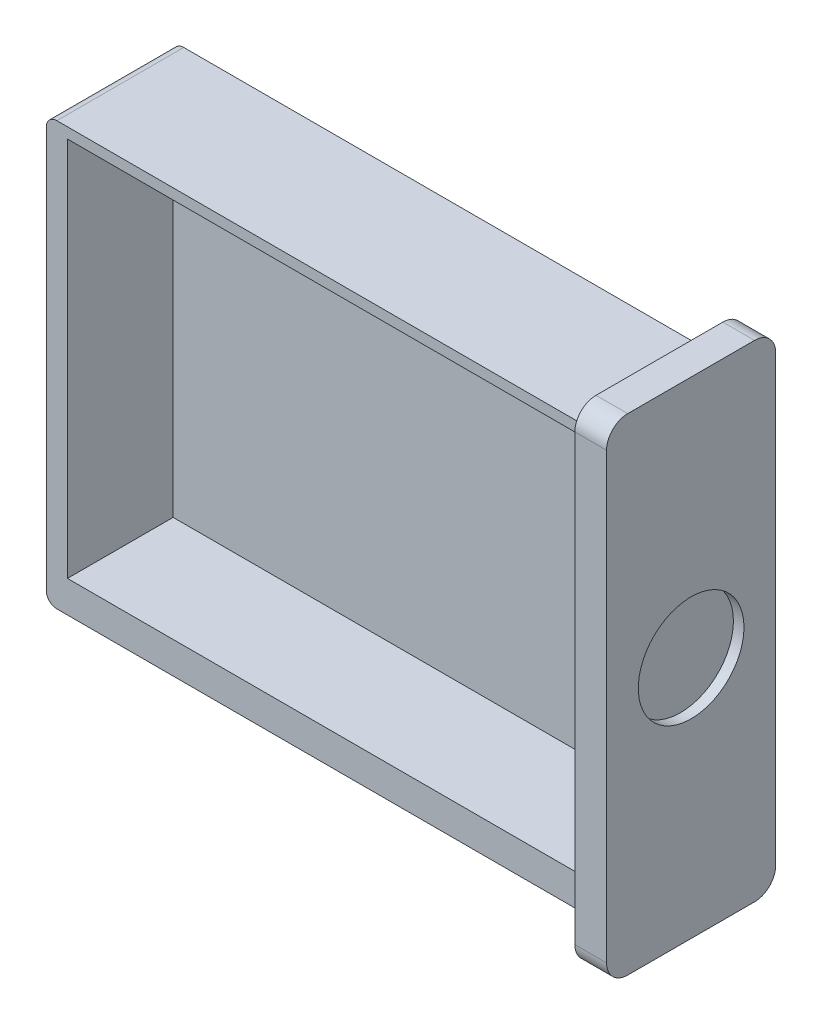
ISO-10303-21;
HEADER;
FILE_DESCRIPTION(('STEP AP214'),'2;1');
FILE_NAME('part.step','',(''),(''),'','','');
FILE_SCHEMA(('AUTOMOTIVE_DESIGN { 1 0 10303 214 1 1 1 1 }'));
ENDSEC;
DATA;
#1=APPLICATION_CONTEXT('core data for automotive mechanical design processes');
#2=APPLICATION_PROTOCOL_DEFINITION('international standard','automotive_design',2000,#1);
#3=PRODUCT_CONTEXT('',#1,'mechanical');
#4=PRODUCT('Part','Part','',(#3));
#5=PRODUCT_RELATED_PRODUCT_CATEGORY('part','',(#4));
#6=PRODUCT_DEFINITION_FORMATION('','',#4);
#7=PRODUCT_DEFINITION_CONTEXT('part definition',#1,'design');
#8=PRODUCT_DEFINITION('design','',#6,#7);
#9=PRODUCT_DEFINITION_SHAPE('','',#8);
#10=(LENGTH_UNIT() NAMED_UNIT(*) SI_UNIT(.MILLI.,.METRE.));
#11=(NAMED_UNIT(*) PLANE_ANGLE_UNIT() SI_UNIT($,.RADIAN.));
#12=(NAMED_UNIT(*) SI_UNIT($,.STERADIAN.) SOLID_ANGLE_UNIT());
#13=UNCERTAINTY_MEASURE_WITH_UNIT(LENGTH_MEASURE(1.E-05),#10,'distance_accuracy_value','');
#14=(GEOMETRIC_REPRESENTATION_CONTEXT(3) GLOBAL_UNCERTAINTY_ASSIGNED_CONTEXT((#13)) GLOBAL_UNIT_ASSIGNED_CONTEXT((#10,
#11,#12)) REPRESENTATION_CONTEXT('',''));
#15=CARTESIAN_POINT('',(0.,0.,0.));
#16=DIRECTION('',(0.,0.,1.));
#17=DIRECTION('',(1.,0.,0.));
#18=AXIS2_PLACEMENT_3D('',#15,#16,#17);
#19=CARTESIAN_POINT('',(-26.,20.,6.));
#20=DIRECTION('',(1.,0.,0.));
#21=DIRECTION('',(0.,0.,-1.));
#22=AXIS2_PLACEMENT_3D('',#19,#20,#21);
#23=PLANE('',#22);
#24=DIRECTION('',(0.,-1.,0.));
#25=VECTOR('',#24,1.);
#26=CARTESIAN_POINT('',(-26.,11.,-1.5));
#27=LINE('',#26,#25);
#28=CARTESIAN_POINT('',(-26.,11.,-1.5));
#29=VERTEX_POINT('',#28);
#30=CARTESIAN_POINT('',(-26.,5.,-1.5));
#31=VERTEX_POINT('',#30);
#32=EDGE_CURVE('E240',#29,#31,#27,.T.);
#33=ORIENTED_EDGE('',*,*,#32,.F.);
#34=DIRECTION('',(0.,0.,-1.));
#35=VECTOR('',#34,1.);
#36=CARTESIAN_POINT('',(-26.,11.,-1.5));
#37=LINE('',#36,#35);
#38=CARTESIAN_POINT('',(-26.,11.,1.5));
#39=VERTEX_POINT('',#38);
#40=EDGE_CURVE('E253',#39,#29,#37,.T.);
#41=ORIENTED_EDGE('',*,*,#40,.F.);
#42=DIRECTION('',(0.,1.,0.));
#43=VECTOR('',#42,1.);
#44=CARTESIAN_POINT('',(-26.,11.,1.5));
#45=LINE('',#44,#43);
#46=CARTESIAN_POINT('',(-26.,5.,1.5));
#47=VERTEX_POINT('',#46);
#48=EDGE_CURVE('E262',#47,#39,#45,.T.);
#49=ORIENTED_EDGE('',*,*,#48,.F.);
#50=DIRECTION('',(0.,0.,1.));
#51=VECTOR('',#50,1.);
#52=CARTESIAN_POINT('',(-26.,5.,-1.5));
#53=LINE('',#52,#51);
#54=EDGE_CURVE('E243',#31,#47,#53,.T.);
#55=ORIENTED_EDGE('',*,*,#54,.F.);
#56=EDGE_LOOP('',(#33,#41,#49,#55));
#57=FACE_BOUND('',#56,.T.);
#58=DIRECTION('',(0.,-1.,0.));
#59=VECTOR('',#58,1.);
#60=CARTESIAN_POINT('',(-26.,20.,-6.));
#61=LINE('',#60,#59);
#62=CARTESIAN_POINT('',(-26.,19.,-6.));
#63=VERTEX_POINT('',#62);
#64=CARTESIAN_POINT('',(-26.,-19.,-6.));
#65=VERTEX_POINT('',#64);
#66=EDGE_CURVE('E334',#63,#65,#61,.T.);
#67=ORIENTED_EDGE('',*,*,#66,.T.);
#68=DIRECTION('',(0.,0.,-1.));
#69=VECTOR('',#68,1.);
#70=CARTESIAN_POINT('',(-26.,-19.,6.));
#71=LINE('',#70,#69);
#72=CARTESIAN_POINT('',(-26.,-19.,6.));
#73=VERTEX_POINT('',#72);
#74=EDGE_CURVE('E380',#65,#73,#71,.F.);
#75=ORIENTED_EDGE('',*,*,#74,.T.);
#76=DIRECTION('',(0.,-1.,0.));
#77=VECTOR('',#76,1.);
#78=CARTESIAN_POINT('',(-26.,20.,6.));
#79=LINE('',#78,#77);
#80=CARTESIAN_POINT('',(-26.,19.,6.));
#81=VERTEX_POINT('',#80);
#82=EDGE_CURVE('E341',#81,#73,#79,.T.);
#83=ORIENTED_EDGE('',*,*,#82,.F.);
#84=DIRECTION('',(0.,0.,-1.));
#85=VECTOR('',#84,1.);
#86=CARTESIAN_POINT('',(-26.,19.,6.));
#87=LINE('',#86,#85);
#88=EDGE_CURVE('E377',#81,#63,#87,.T.);
#89=ORIENTED_EDGE('',*,*,#88,.T.);
#90=EDGE_LOOP('',(#67,#75,#83,#89));
#91=FACE_BOUND('',#90,.T.);
#92=DIRECTION('',(0.,0.,1.));
#93=VECTOR('',#92,1.);
#94=CARTESIAN_POINT('',(-26.,-11.,-1.5));
#95=LINE('',#94,#93);
#96=CARTESIAN_POINT('',(-26.,-11.,-1.5));
#97=VERTEX_POINT('',#96);
#98=CARTESIAN_POINT('',(-26.,-11.,1.5));
#99=VERTEX_POINT('',#98);
#100=EDGE_CURVE('E239',#97,#99,#95,.T.);
#101=ORIENTED_EDGE('',*,*,#100,.F.);
#102=DIRECTION('',(0.,-1.,0.));
#103=VECTOR('',#102,1.);
#104=CARTESIAN_POINT('',(-26.,-11.,-1.5));
#105=LINE('',#104,#103);
#106=CARTESIAN_POINT('',(-26.,-5.,-1.5));
#107=VERTEX_POINT('',#106);
#108=EDGE_CURVE('E236',#107,#97,#105,.T.);
#109=ORIENTED_EDGE('',*,*,#108,.F.);
#110=DIRECTION('',(0.,0.,-1.));
#111=VECTOR('',#110,1.);
#112=CARTESIAN_POINT('',(-26.,-5.,-1.5));
#113=LINE('',#112,#111);
#114=CARTESIAN_POINT('',(-26.,-5.,1.5));
#115=VERTEX_POINT('',#114);
#116=EDGE_CURVE('E54',#115,#107,#113,.T.);
#117=ORIENTED_EDGE('',*,*,#116,.F.);
#118=DIRECTION('',(0.,1.,0.));
#119=VECTOR('',#118,1.);
#120=CARTESIAN_POINT('',(-26.,-11.,1.5));
#121=LINE('',#120,#119);
#122=EDGE_CURVE('E49',#99,#115,#121,.T.);
#123=ORIENTED_EDGE('',*,*,#122,.F.);
#124=EDGE_LOOP('',(#101,#109,#117,#123));
#125=FACE_BOUND('',#124,.T.);
#126=ADVANCED_FACE('F34',(#57,#91,#125),#23,.F.);
#127=CARTESIAN_POINT('',(-26.,-20.,6.));
#128=DIRECTION('',(0.,1.,0.));
#129=DIRECTION('',(0.,0.,1.));
#130=AXIS2_PLACEMENT_3D('',#127,#128,#129);
#131=PLANE('',#130);
#132=DIRECTION('',(1.,0.,0.));
#133=VECTOR('',#132,1.);
#134=CARTESIAN_POINT('',(-26.,-20.,6.));
#135=LINE('',#134,#133);
#136=CARTESIAN_POINT('',(-25.,-20.,6.));
#137=VERTEX_POINT('',#136);
#138=CARTESIAN_POINT('',(25.,-20.,6.));
#139=VERTEX_POINT('',#138);
#140=EDGE_CURVE('E344',#137,#139,#135,.T.);
#141=ORIENTED_EDGE('',*,*,#140,.F.);
#142=DIRECTION('',(0.,0.,-1.));
#143=VECTOR('',#142,1.);
#144=CARTESIAN_POINT('',(-25.,-20.,6.));
#145=LINE('',#144,#143);
#146=CARTESIAN_POINT('',(-25.,-20.,-6.));
#147=VERTEX_POINT('',#146);
#148=EDGE_CURVE('E366',#137,#147,#145,.T.);
#149=ORIENTED_EDGE('',*,*,#148,.T.);
#150=DIRECTION('',(1.,0.,0.));
#151=VECTOR('',#150,1.);
#152=CARTESIAN_POINT('',(-26.,-20.,-6.));
#153=LINE('',#152,#151);
#154=CARTESIAN_POINT('',(25.,-20.,-6.));
#155=VERTEX_POINT('',#154);
#156=EDGE_CURVE('E357',#147,#155,#153,.T.);
#157=ORIENTED_EDGE('',*,*,#156,.T.);
#158=DIRECTION('',(0.,0.,-1.));
#159=VECTOR('',#158,1.);
#160=CARTESIAN_POINT('',(25.,-20.,6.));
#161=LINE('',#160,#159);
#162=EDGE_CURVE('E354',#155,#139,#161,.F.);
#163=ORIENTED_EDGE('',*,*,#162,.T.);
#164=EDGE_LOOP('',(#141,#149,#157,#163));
#165=FACE_BOUND('',#164,.T.);
#166=ADVANCED_FACE('F478',(#165),#131,.F.);
#167=CARTESIAN_POINT('',(-26.,20.,6.));
#168=DIRECTION('',(0.,-1.,0.));
#169=DIRECTION('',(0.,0.,-1.));
#170=AXIS2_PLACEMENT_3D('',#167,#168,#169);
#171=PLANE('',#170);
#172=DIRECTION('',(-1.,0.,0.));
#173=VECTOR('',#172,1.);
#174=CARTESIAN_POINT('',(-26.,20.,-6.));
#175=LINE('',#174,#173);
#176=CARTESIAN_POINT('',(25.,20.,-6.));
#177=VERTEX_POINT('',#176);
#178=CARTESIAN_POINT('',(-25.,20.,-6.));
#179=VERTEX_POINT('',#178);
#180=EDGE_CURVE('E345',#177,#179,#175,.T.);
#181=ORIENTED_EDGE('',*,*,#180,.T.);
#182=DIRECTION('',(0.,0.,-1.));
#183=VECTOR('',#182,1.);
#184=CARTESIAN_POINT('',(-25.,20.,6.));
#185=LINE('',#184,#183);
#186=CARTESIAN_POINT('',(-25.,20.,6.));
#187=VERTEX_POINT('',#186);
#188=EDGE_CURVE('E399',#179,#187,#185,.F.);
#189=ORIENTED_EDGE('',*,*,#188,.T.);
#190=DIRECTION('',(-1.,0.,0.));
#191=VECTOR('',#190,1.);
#192=CARTESIAN_POINT('',(-26.,20.,6.));
#193=LINE('',#192,#191);
#194=CARTESIAN_POINT('',(25.,20.,6.));
#195=VERTEX_POINT('',#194);
#196=EDGE_CURVE('E351',#195,#187,#193,.T.);
#197=ORIENTED_EDGE('',*,*,#196,.F.);
#198=DIRECTION('',(0.,0.,-1.));
#199=VECTOR('',#198,1.);
#200=CARTESIAN_POINT('',(25.,20.,6.));
#201=LINE('',#200,#199);
#202=EDGE_CURVE('E396',#195,#177,#201,.T.);
#203=ORIENTED_EDGE('',*,*,#202,.T.);
#204=EDGE_LOOP('',(#181,#189,#197,#203));
#205=FACE_BOUND('',#204,.T.);
#206=ADVANCED_FACE('F484',(#205),#171,.F.);
#207=CARTESIAN_POINT('',(0.,0.,6.));
#208=DIRECTION('',(0.,0.,1.));
#209=DIRECTION('',(1.,0.,0.));
#210=AXIS2_PLACEMENT_3D('',#207,#208,#209);
#211=PLANE('',#210);
#212=DIRECTION('',(0.,-1.,0.));
#213=VECTOR('',#212,1.);
#214=CARTESIAN_POINT('',(-24.,19.,6.));
#215=LINE('',#214,#213);
#216=CARTESIAN_POINT('',(-24.,19.,6.));
#217=VERTEX_POINT('',#216);
#218=CARTESIAN_POINT('',(-24.,-17.,6.));
#219=VERTEX_POINT('',#218);
#220=EDGE_CURVE('E298',#217,#219,#215,.T.);
#221=ORIENTED_EDGE('',*,*,#220,.F.);
#222=DIRECTION('',(-1.,0.,0.));
#223=VECTOR('',#222,1.);
#224=CARTESIAN_POINT('',(-24.,19.,6.));
#225=LINE('',#224,#223);
#226=CARTESIAN_POINT('',(24.,19.,6.));
#227=VERTEX_POINT('',#226);
#228=EDGE_CURVE('E313',#227,#217,#225,.T.);
#229=ORIENTED_EDGE('',*,*,#228,.F.);
#230=DIRECTION('',(0.,1.,0.));
#231=VECTOR('',#230,1.);
#232=CARTESIAN_POINT('',(24.,19.,6.));
#233=LINE('',#232,#231);
#234=CARTESIAN_POINT('',(24.,-17.,6.));
#235=VERTEX_POINT('',#234);
#236=EDGE_CURVE('E327',#235,#227,#233,.T.);
#237=ORIENTED_EDGE('',*,*,#236,.F.);
#238=DIRECTION('',(1.,0.,0.));
#239=VECTOR('',#238,1.);
#240=CARTESIAN_POINT('',(-24.,-17.,6.));
#241=LINE('',#240,#239);
#242=EDGE_CURVE('E324',#219,#235,#241,.T.);
#243=ORIENTED_EDGE('',*,*,#242,.F.);
#244=EDGE_LOOP('',(#221,#229,#237,#243));
#245=FACE_BOUND('',#244,.T.);
#246=ORIENTED_EDGE('',*,*,#82,.T.);
#247=CARTESIAN_POINT('',(-25.,-19.,6.));
#248=DIRECTION('',(0.,0.,1.));
#249=DIRECTION('',(1.,0.,0.));
#250=AXIS2_PLACEMENT_3D('',#247,#248,#249);
#251=CIRCLE('',#250,1.);
#252=EDGE_CURVE('E388',#73,#137,#251,.T.);
#253=ORIENTED_EDGE('',*,*,#252,.T.);
#254=ORIENTED_EDGE('',*,*,#140,.T.);
#255=CARTESIAN_POINT('',(25.,-19.,6.));
#256=DIRECTION('',(0.,0.,1.));
#257=DIRECTION('',(1.,0.,0.));
#258=AXIS2_PLACEMENT_3D('',#255,#256,#257);
#259=CIRCLE('',#258,1.);
#260=CARTESIAN_POINT('',(26.,-19.,6.));
#261=VERTEX_POINT('',#260);
#262=EDGE_CURVE('E386',#139,#261,#259,.T.);
#263=ORIENTED_EDGE('',*,*,#262,.T.);
#264=DIRECTION('',(0.,1.,0.));
#265=VECTOR('',#264,1.);
#266=CARTESIAN_POINT('',(26.,20.,6.));
#267=LINE('',#266,#265);
#268=CARTESIAN_POINT('',(26.000000035,19.,6.));
#269=VERTEX_POINT('',#268);
#270=EDGE_CURVE('E348',#261,#269,#267,.T.);
#271=ORIENTED_EDGE('',*,*,#270,.T.);
#272=CARTESIAN_POINT('',(25.,19.,6.));
#273=DIRECTION('',(0.,0.,1.));
#274=DIRECTION('',(1.,0.,0.));
#275=AXIS2_PLACEMENT_3D('',#272,#273,#274);
#276=CIRCLE('',#275,1.);
#277=EDGE_CURVE('E382',#269,#195,#276,.T.);
#278=ORIENTED_EDGE('',*,*,#277,.T.);
#279=ORIENTED_EDGE('',*,*,#196,.T.);
#280=CARTESIAN_POINT('',(-25.,19.,6.));
#281=DIRECTION('',(0.,0.,1.));
#282=DIRECTION('',(1.,0.,0.));
#283=AXIS2_PLACEMENT_3D('',#280,#281,#282);
#284=CIRCLE('',#283,1.);
#285=EDGE_CURVE('E384',#187,#81,#284,.T.);
#286=ORIENTED_EDGE('',*,*,#285,.T.);
#287=EDGE_LOOP('',(#246,#253,#254,#263,#271,#278,#279,#286));
#288=FACE_BOUND('',#287,.T.);
#289=ADVANCED_FACE('F548',(#245,#288),#211,.T.);
#290=CARTESIAN_POINT('',(0.,0.,-6.));
#291=DIRECTION('',(0.,0.,1.));
#292=DIRECTION('',(1.,0.,0.));
#293=AXIS2_PLACEMENT_3D('',#290,#291,#292);
#294=PLANE('',#293);
#295=ORIENTED_EDGE('',*,*,#156,.F.);
#296=CARTESIAN_POINT('',(-25.,-19.,-6.));
#297=DIRECTION('',(0.,0.,1.));
#298=DIRECTION('',(1.,0.,0.));
#299=AXIS2_PLACEMENT_3D('',#296,#297,#298);
#300=CIRCLE('',#299,1.);
#301=EDGE_CURVE('E375',#147,#65,#300,.F.);
#302=ORIENTED_EDGE('',*,*,#301,.T.);
#303=ORIENTED_EDGE('',*,*,#66,.F.);
#304=CARTESIAN_POINT('',(-25.,19.,-6.));
#305=DIRECTION('',(0.,0.,1.));
#306=DIRECTION('',(1.,0.,0.));
#307=AXIS2_PLACEMENT_3D('',#304,#305,#306);
#308=CIRCLE('',#307,1.);
#309=EDGE_CURVE('E371',#63,#179,#308,.F.);
#310=ORIENTED_EDGE('',*,*,#309,.T.);
#311=ORIENTED_EDGE('',*,*,#180,.F.);
#312=CARTESIAN_POINT('',(25.,19.,-6.));
#313=DIRECTION('',(0.,0.,1.));
#314=DIRECTION('',(1.,0.,0.));
#315=AXIS2_PLACEMENT_3D('',#312,#313,#314);
#316=CIRCLE('',#315,1.);
#317=CARTESIAN_POINT('',(26.,19.,-6.));
#318=VERTEX_POINT('',#317);
#319=EDGE_CURVE('E369',#177,#318,#316,.F.);
#320=ORIENTED_EDGE('',*,*,#319,.T.);
#321=DIRECTION('',(0.,1.,0.));
#322=VECTOR('',#321,1.);
#323=CARTESIAN_POINT('',(26.,20.,-6.));
#324=LINE('',#323,#322);
#325=CARTESIAN_POINT('',(26.,-19.,-6.));
#326=VERTEX_POINT('',#325);
#327=EDGE_CURVE('E360',#326,#318,#324,.T.);
#328=ORIENTED_EDGE('',*,*,#327,.F.);
#329=CARTESIAN_POINT('',(25.,-19.,-6.));
#330=DIRECTION('',(0.,0.,1.));
#331=DIRECTION('',(1.,0.,0.));
#332=AXIS2_PLACEMENT_3D('',#329,#330,#331);
#333=CIRCLE('',#332,1.);
#334=EDGE_CURVE('E373',#326,#155,#333,.F.);
#335=ORIENTED_EDGE('',*,*,#334,.T.);
#336=EDGE_LOOP('',(#295,#302,#303,#310,#311,#320,#328,#335));
#337=FACE_BOUND('',#336,.T.);
#338=ADVANCED_FACE('F494',(#337),#294,.F.);
#339=CARTESIAN_POINT('',(-25.,-19.,6.));
#340=DIRECTION('',(0.,0.,-1.));
#341=DIRECTION('',(-1.,0.,0.));
#342=AXIS2_PLACEMENT_3D('',#339,#340,#341);
#343=CYLINDRICAL_SURFACE('',#342,1.);
#344=ORIENTED_EDGE('',*,*,#252,.F.);
#345=ORIENTED_EDGE('',*,*,#74,.F.);
#346=ORIENTED_EDGE('',*,*,#301,.F.);
#347=ORIENTED_EDGE('',*,*,#148,.F.);
#348=EDGE_LOOP('',(#344,#345,#346,#347));
#349=FACE_BOUND('',#348,.T.);
#350=ADVANCED_FACE('F490',(#349),#343,.T.);
#351=CARTESIAN_POINT('',(25.,-19.,6.));
#352=DIRECTION('',(0.,0.,-1.));
#353=DIRECTION('',(-1.,0.,0.));
#354=AXIS2_PLACEMENT_3D('',#351,#352,#353);
#355=CYLINDRICAL_SURFACE('',#354,1.);
#356=ORIENTED_EDGE('',*,*,#262,.F.);
#357=ORIENTED_EDGE('',*,*,#162,.F.);
#358=ORIENTED_EDGE('',*,*,#334,.F.);
#359=DIRECTION('',(0.,0.,-1.));
#360=VECTOR('',#359,1.);
#361=CARTESIAN_POINT('',(26.,-19.,6.));
#362=LINE('',#361,#360);
#363=EDGE_CURVE('E393',#261,#326,#362,.T.);
#364=ORIENTED_EDGE('',*,*,#363,.F.);
#365=EDGE_LOOP('',(#356,#357,#358,#364));
#366=FACE_BOUND('',#365,.T.);
#367=ADVANCED_FACE('F493',(#366),#355,.T.);
#368=CARTESIAN_POINT('',(-25.,19.,6.));
#369=DIRECTION('',(0.,0.,-1.));
#370=DIRECTION('',(-1.,0.,0.));
#371=AXIS2_PLACEMENT_3D('',#368,#369,#370);
#372=CYLINDRICAL_SURFACE('',#371,1.);
#373=ORIENTED_EDGE('',*,*,#285,.F.);
#374=ORIENTED_EDGE('',*,*,#188,.F.);
#375=ORIENTED_EDGE('',*,*,#309,.F.);
#376=ORIENTED_EDGE('',*,*,#88,.F.);
#377=EDGE_LOOP('',(#373,#374,#375,#376));
#378=FACE_BOUND('',#377,.T.);
#379=ADVANCED_FACE('F498',(#378),#372,.T.);
#380=CARTESIAN_POINT('',(25.,19.,6.));
#381=DIRECTION('',(0.,0.,-1.));
#382=DIRECTION('',(-1.,0.,0.));
#383=AXIS2_PLACEMENT_3D('',#380,#381,#382);
#384=CYLINDRICAL_SURFACE('',#383,1.);
#385=ORIENTED_EDGE('',*,*,#277,.F.);
#386=DIRECTION('',(0.,0.,-1.));
#387=VECTOR('',#386,1.);
#388=CARTESIAN_POINT('',(26.,19.,6.));
#389=LINE('',#388,#387);
#390=EDGE_CURVE('E390',#318,#269,#389,.F.);
#391=ORIENTED_EDGE('',*,*,#390,.F.);
#392=ORIENTED_EDGE('',*,*,#319,.F.);
#393=ORIENTED_EDGE('',*,*,#202,.F.);
#394=EDGE_LOOP('',(#385,#391,#392,#393));
#395=FACE_BOUND('',#394,.T.);
#396=ADVANCED_FACE('F502',(#395),#384,.T.);
#397=CARTESIAN_POINT('',(-24.,19.,-4.));
#398=DIRECTION('',(-1.,0.,0.));
#399=DIRECTION('',(0.,0.,1.));
#400=AXIS2_PLACEMENT_3D('',#397,#398,#399);
#401=PLANE('',#400);
#402=ORIENTED_EDGE('',*,*,#220,.T.);
#403=DIRECTION('',(0.,0.,1.));
#404=VECTOR('',#403,1.);
#405=CARTESIAN_POINT('',(-24.,-17.,-4.));
#406=LINE('',#405,#404);
#407=CARTESIAN_POINT('',(-24.,-17.,-4.));
#408=VERTEX_POINT('',#407);
#409=EDGE_CURVE('E322',#408,#219,#406,.T.);
#410=ORIENTED_EDGE('',*,*,#409,.F.);
#411=DIRECTION('',(0.,-1.,0.));
#412=VECTOR('',#411,1.);
#413=CARTESIAN_POINT('',(-24.,19.,-4.));
#414=LINE('',#413,#412);
#415=CARTESIAN_POINT('',(-24.,19.,-4.));
#416=VERTEX_POINT('',#415);
#417=EDGE_CURVE('E309',#416,#408,#414,.T.);
#418=ORIENTED_EDGE('',*,*,#417,.F.);
#419=DIRECTION('',(0.,0.,1.));
#420=VECTOR('',#419,1.);
#421=CARTESIAN_POINT('',(-24.,19.,-4.));
#422=LINE('',#421,#420);
#423=EDGE_CURVE('E332',#416,#217,#422,.T.);
#424=ORIENTED_EDGE('',*,*,#423,.T.);
#425=EDGE_LOOP('',(#402,#410,#418,#424));
#426=FACE_BOUND('',#425,.T.);
#427=ADVANCED_FACE('F506',(#426),#401,.F.);
#428=CARTESIAN_POINT('',(-24.,19.,-4.));
#429=DIRECTION('',(0.,1.,0.));
#430=DIRECTION('',(-1.,0.,0.));
#431=AXIS2_PLACEMENT_3D('',#428,#429,#430);
#432=PLANE('',#431);
#433=ORIENTED_EDGE('',*,*,#228,.T.);
#434=ORIENTED_EDGE('',*,*,#423,.F.);
#435=DIRECTION('',(-1.,0.,0.));
#436=VECTOR('',#435,1.);
#437=CARTESIAN_POINT('',(-24.,19.,-4.));
#438=LINE('',#437,#436);
#439=CARTESIAN_POINT('',(24.,19.,-4.));
#440=VERTEX_POINT('',#439);
#441=EDGE_CURVE('E319',#440,#416,#438,.T.);
#442=ORIENTED_EDGE('',*,*,#441,.F.);
#443=DIRECTION('',(0.,0.,1.));
#444=VECTOR('',#443,1.);
#445=CARTESIAN_POINT('',(24.,19.,-4.));
#446=LINE('',#445,#444);
#447=EDGE_CURVE('E335',#440,#227,#446,.T.);
#448=ORIENTED_EDGE('',*,*,#447,.T.);
#449=EDGE_LOOP('',(#433,#434,#442,#448));
#450=FACE_BOUND('',#449,.T.);
#451=ADVANCED_FACE('F534',(#450),#432,.F.);
#452=CARTESIAN_POINT('',(24.,19.,-4.));
#453=DIRECTION('',(1.,0.,0.));
#454=DIRECTION('',(0.,0.,-1.));
#455=AXIS2_PLACEMENT_3D('',#452,#453,#454);
#456=PLANE('',#455);
#457=ORIENTED_EDGE('',*,*,#236,.T.);
#458=ORIENTED_EDGE('',*,*,#447,.F.);
#459=DIRECTION('',(0.,1.,0.));
#460=VECTOR('',#459,1.);
#461=CARTESIAN_POINT('',(24.,19.,-4.));
#462=LINE('',#461,#460);
#463=CARTESIAN_POINT('',(24.,-17.,-4.));
#464=VERTEX_POINT('',#463);
#465=EDGE_CURVE('E316',#464,#440,#462,.T.);
#466=ORIENTED_EDGE('',*,*,#465,.F.);
#467=DIRECTION('',(0.,0.,1.));
#468=VECTOR('',#467,1.);
#469=CARTESIAN_POINT('',(24.,-17.,-4.));
#470=LINE('',#469,#468);
#471=EDGE_CURVE('E337',#464,#235,#470,.T.);
#472=ORIENTED_EDGE('',*,*,#471,.T.);
#473=EDGE_LOOP('',(#457,#458,#466,#472));
#474=FACE_BOUND('',#473,.T.);
#475=ADVANCED_FACE('F537',(#474),#456,.F.);
#476=CARTESIAN_POINT('',(-24.,-17.,-4.));
#477=DIRECTION('',(0.,-1.,0.));
#478=DIRECTION('',(1.,0.,0.));
#479=AXIS2_PLACEMENT_3D('',#476,#477,#478);
#480=PLANE('',#479);
#481=ORIENTED_EDGE('',*,*,#242,.T.);
#482=ORIENTED_EDGE('',*,*,#471,.F.);
#483=DIRECTION('',(1.,0.,0.));
#484=VECTOR('',#483,1.);
#485=CARTESIAN_POINT('',(-24.,-17.,-4.));
#486=LINE('',#485,#484);
#487=EDGE_CURVE('E312',#408,#464,#486,.T.);
#488=ORIENTED_EDGE('',*,*,#487,.F.);
#489=ORIENTED_EDGE('',*,*,#409,.T.);
#490=EDGE_LOOP('',(#481,#482,#488,#489));
#491=FACE_BOUND('',#490,.T.);
#492=ADVANCED_FACE('F532',(#491),#480,.F.);
#493=CARTESIAN_POINT('',(0.,0.,-4.));
#494=DIRECTION('',(0.,0.,1.));
#495=DIRECTION('',(1.,0.,0.));
#496=AXIS2_PLACEMENT_3D('',#493,#494,#495);
#497=PLANE('',#496);
#498=ORIENTED_EDGE('',*,*,#417,.T.);
#499=ORIENTED_EDGE('',*,*,#487,.T.);
#500=ORIENTED_EDGE('',*,*,#465,.T.);
#501=ORIENTED_EDGE('',*,*,#441,.T.);
#502=EDGE_LOOP('',(#498,#499,#500,#501));
#503=FACE_BOUND('',#502,.T.);
#504=ADVANCED_FACE('F529',(#503),#497,.T.);
#505=CARTESIAN_POINT('',(29.00000007,23.,8.00000000000001));
#506=DIRECTION('',(0.,0.,-1.));
#507=DIRECTION('',(0.,1.,0.));
#508=AXIS2_PLACEMENT_3D('',#505,#506,#507);
#509=PLANE('',#508);
#510=DIRECTION('',(0.,-1.,0.));
#511=VECTOR('',#510,1.);
#512=CARTESIAN_POINT('',(26.00000007,23.,8.00000000000001));
#513=LINE('',#512,#511);
#514=CARTESIAN_POINT('',(26.00000007,21.,8.00000000000001));
#515=VERTEX_POINT('',#514);
#516=CARTESIAN_POINT('',(26.00000007,-21.,8.));
#517=VERTEX_POINT('',#516);
#518=EDGE_CURVE('E282',#515,#517,#513,.T.);
#519=ORIENTED_EDGE('',*,*,#518,.T.);
#520=DIRECTION('',(-1.,0.,0.));
#521=VECTOR('',#520,1.);
#522=CARTESIAN_POINT('',(29.00000007,-21.,8.));
#523=LINE('',#522,#521);
#524=CARTESIAN_POINT('',(29.00000007,-21.,8.));
#525=VERTEX_POINT('',#524);
#526=EDGE_CURVE('E430',#517,#525,#523,.F.);
#527=ORIENTED_EDGE('',*,*,#526,.T.);
#528=DIRECTION('',(0.,-1.,0.));
#529=VECTOR('',#528,1.);
#530=CARTESIAN_POINT('',(29.00000007,23.,8.00000000000001));
#531=LINE('',#530,#529);
#532=CARTESIAN_POINT('',(29.00000007,21.,8.00000000000001));
#533=VERTEX_POINT('',#532);
#534=EDGE_CURVE('E285',#533,#525,#531,.T.);
#535=ORIENTED_EDGE('',*,*,#534,.F.);
#536=DIRECTION('',(-1.,0.,0.));
#537=VECTOR('',#536,1.);
#538=CARTESIAN_POINT('',(29.00000007,21.,8.00000000000001));
#539=LINE('',#538,#537);
#540=EDGE_CURVE('E427',#533,#515,#539,.T.);
#541=ORIENTED_EDGE('',*,*,#540,.T.);
#542=EDGE_LOOP('',(#519,#527,#535,#541));
#543=FACE_BOUND('',#542,.T.);
#544=ADVANCED_FACE('F446',(#543),#509,.F.);
#545=CARTESIAN_POINT('',(29.00000007,-23.,8.));
#546=DIRECTION('',(0.,1.,0.));
#547=DIRECTION('',(0.,0.,1.));
#548=AXIS2_PLACEMENT_3D('',#545,#546,#547);
#549=PLANE('',#548);
#550=DIRECTION('',(0.,0.,-1.));
#551=VECTOR('',#550,1.);
#552=CARTESIAN_POINT('',(26.00000007,-23.,8.));
#553=LINE('',#552,#551);
#554=CARTESIAN_POINT('',(26.00000007,-23.,6.));
#555=VERTEX_POINT('',#554);
#556=CARTESIAN_POINT('',(26.00000007,-23.,-6.));
#557=VERTEX_POINT('',#556);
#558=EDGE_CURVE('E301',#555,#557,#553,.T.);
#559=ORIENTED_EDGE('',*,*,#558,.T.);
#560=DIRECTION('',(-1.,0.,0.));
#561=VECTOR('',#560,1.);
#562=CARTESIAN_POINT('',(29.00000007,-23.,-6.));
#563=LINE('',#562,#561);
#564=CARTESIAN_POINT('',(29.00000007,-23.,-6.));
#565=VERTEX_POINT('',#564);
#566=EDGE_CURVE('E417',#557,#565,#563,.F.);
#567=ORIENTED_EDGE('',*,*,#566,.T.);
#568=DIRECTION('',(0.,0.,-1.));
#569=VECTOR('',#568,1.);
#570=CARTESIAN_POINT('',(29.00000007,-23.,8.));
#571=LINE('',#570,#569);
#572=CARTESIAN_POINT('',(29.00000007,-23.,6.));
#573=VERTEX_POINT('',#572);
#574=EDGE_CURVE('E288',#573,#565,#571,.T.);
#575=ORIENTED_EDGE('',*,*,#574,.F.);
#576=DIRECTION('',(-1.,0.,0.));
#577=VECTOR('',#576,1.);
#578=CARTESIAN_POINT('',(29.00000007,-23.,6.));
#579=LINE('',#578,#577);
#580=EDGE_CURVE('E414',#573,#555,#579,.T.);
#581=ORIENTED_EDGE('',*,*,#580,.T.);
#582=EDGE_LOOP('',(#559,#567,#575,#581));
#583=FACE_BOUND('',#582,.T.);
#584=ADVANCED_FACE('F458',(#583),#549,.F.);
#585=CARTESIAN_POINT('',(29.00000007,23.,-8.00000000000001));
#586=DIRECTION('',(0.,0.,1.));
#587=DIRECTION('',(0.,-1.,0.));
#588=AXIS2_PLACEMENT_3D('',#585,#586,#587);
#589=PLANE('',#588);
#590=DIRECTION('',(0.,1.,0.));
#591=VECTOR('',#590,1.);
#592=CARTESIAN_POINT('',(29.00000007,23.,-8.00000000000001));
#593=LINE('',#592,#591);
#594=CARTESIAN_POINT('',(29.00000007,-21.,-8.));
#595=VERTEX_POINT('',#594);
#596=CARTESIAN_POINT('',(29.00000007,21.,-8.00000000000001));
#597=VERTEX_POINT('',#596);
#598=EDGE_CURVE('E292',#595,#597,#593,.T.);
#599=ORIENTED_EDGE('',*,*,#598,.F.);
#600=DIRECTION('',(-1.,0.,0.));
#601=VECTOR('',#600,1.);
#602=CARTESIAN_POINT('',(29.00000007,-21.,-8.));
#603=LINE('',#602,#601);
#604=CARTESIAN_POINT('',(26.00000007,-21.,-8.));
#605=VERTEX_POINT('',#604);
#606=EDGE_CURVE('E403',#595,#605,#603,.T.);
#607=ORIENTED_EDGE('',*,*,#606,.T.);
#608=DIRECTION('',(0.,1.,0.));
#609=VECTOR('',#608,1.);
#610=CARTESIAN_POINT('',(26.00000007,23.,-8.00000000000001));
#611=LINE('',#610,#609);
#612=CARTESIAN_POINT('',(26.00000007,21.,-8.00000000000001));
#613=VERTEX_POINT('',#612);
#614=EDGE_CURVE('E304',#605,#613,#611,.T.);
#615=ORIENTED_EDGE('',*,*,#614,.T.);
#616=DIRECTION('',(-1.,0.,0.));
#617=VECTOR('',#616,1.);
#618=CARTESIAN_POINT('',(29.00000007,21.,-8.00000000000001));
#619=LINE('',#618,#617);
#620=EDGE_CURVE('E401',#613,#597,#619,.F.);
#621=ORIENTED_EDGE('',*,*,#620,.T.);
#622=EDGE_LOOP('',(#599,#607,#615,#621));
#623=FACE_BOUND('',#622,.T.);
#624=ADVANCED_FACE('F466',(#623),#589,.F.);
#625=CARTESIAN_POINT('',(29.00000007,23.,8.00000000000001));
#626=DIRECTION('',(0.,-1.,0.));
#627=DIRECTION('',(0.,0.,-1.));
#628=AXIS2_PLACEMENT_3D('',#625,#626,#627);
#629=PLANE('',#628);
#630=DIRECTION('',(0.,0.,1.));
#631=VECTOR('',#630,1.);
#632=CARTESIAN_POINT('',(29.00000007,23.,8.00000000000001));
#633=LINE('',#632,#631);
#634=CARTESIAN_POINT('',(29.00000007,23.,-6.00000000000001));
#635=VERTEX_POINT('',#634);
#636=CARTESIAN_POINT('',(29.00000007,23.,6.00000000000001));
#637=VERTEX_POINT('',#636);
#638=EDGE_CURVE('E295',#635,#637,#633,.T.);
#639=ORIENTED_EDGE('',*,*,#638,.F.);
#640=DIRECTION('',(-1.,0.,0.));
#641=VECTOR('',#640,1.);
#642=CARTESIAN_POINT('',(29.00000007,23.,-6.00000000000001));
#643=LINE('',#642,#641);
#644=CARTESIAN_POINT('',(26.00000007,23.,-6.00000000000001));
#645=VERTEX_POINT('',#644);
#646=EDGE_CURVE('E11',#635,#645,#643,.T.);
#647=ORIENTED_EDGE('',*,*,#646,.T.);
#648=DIRECTION('',(0.,0.,1.));
#649=VECTOR('',#648,1.);
#650=CARTESIAN_POINT('',(26.00000007,23.,8.00000000000001));
#651=LINE('',#650,#649);
#652=CARTESIAN_POINT('',(26.00000007,23.,6.00000000000001));
#653=VERTEX_POINT('',#652);
#654=EDGE_CURVE('E289',#645,#653,#651,.T.);
#655=ORIENTED_EDGE('',*,*,#654,.T.);
#656=DIRECTION('',(-1.,0.,0.));
#657=VECTOR('',#656,1.);
#658=CARTESIAN_POINT('',(29.00000007,23.,6.00000000000001));
#659=LINE('',#658,#657);
#660=EDGE_CURVE('E42',#653,#637,#659,.F.);
#661=ORIENTED_EDGE('',*,*,#660,.T.);
#662=EDGE_LOOP('',(#639,#647,#655,#661));
#663=FACE_BOUND('',#662,.T.);
#664=ADVANCED_FACE('F434',(#663),#629,.F.);
#665=CARTESIAN_POINT('',(29.00000007,0.,0.));
#666=DIRECTION('',(1.,0.,0.));
#667=DIRECTION('',(0.,0.,-1.));
#668=AXIS2_PLACEMENT_3D('',#665,#666,#667);
#669=PLANE('',#668);
#670=CARTESIAN_POINT('',(29.00000007,0.,0.));
#671=DIRECTION('',(1.,0.,0.));
#672=DIRECTION('',(0.,0.,-1.));
#673=AXIS2_PLACEMENT_3D('',#670,#671,#672);
#674=CIRCLE('',#673,5.);
#675=CARTESIAN_POINT('',(29.00000007,0.,-5.));
#676=VERTEX_POINT('',#675);
#677=EDGE_CURVE('E278',#676,#676,#674,.T.);
#678=ORIENTED_EDGE('',*,*,#677,.F.);
#679=EDGE_LOOP('',(#678));
#680=FACE_BOUND('',#679,.T.);
#681=ORIENTED_EDGE('',*,*,#574,.T.);
#682=CARTESIAN_POINT('',(29.00000007,-21.,-6.));
#683=DIRECTION('',(1.,0.,0.));
#684=DIRECTION('',(0.,0.,-1.));
#685=AXIS2_PLACEMENT_3D('',#682,#683,#684);
#686=CIRCLE('',#685,2.);
#687=EDGE_CURVE('E425',#565,#595,#686,.T.);
#688=ORIENTED_EDGE('',*,*,#687,.T.);
#689=ORIENTED_EDGE('',*,*,#598,.T.);
#690=CARTESIAN_POINT('',(29.00000007,21.,-6.00000000000001));
#691=DIRECTION('',(1.,0.,0.));
#692=DIRECTION('',(0.,0.,-1.));
#693=AXIS2_PLACEMENT_3D('',#690,#691,#692);
#694=CIRCLE('',#693,2.);
#695=EDGE_CURVE('E421',#597,#635,#694,.T.);
#696=ORIENTED_EDGE('',*,*,#695,.T.);
#697=ORIENTED_EDGE('',*,*,#638,.T.);
#698=CARTESIAN_POINT('',(29.00000007,21.,6.00000000000001));
#699=DIRECTION('',(1.,0.,0.));
#700=DIRECTION('',(0.,0.,-1.));
#701=AXIS2_PLACEMENT_3D('',#698,#699,#700);
#702=CIRCLE('',#701,2.);
#703=EDGE_CURVE('E419',#637,#533,#702,.T.);
#704=ORIENTED_EDGE('',*,*,#703,.T.);
#705=ORIENTED_EDGE('',*,*,#534,.T.);
#706=CARTESIAN_POINT('',(29.00000007,-21.,6.));
#707=DIRECTION('',(1.,0.,0.));
#708=DIRECTION('',(0.,0.,-1.));
#709=AXIS2_PLACEMENT_3D('',#706,#707,#708);
#710=CIRCLE('',#709,2.);
#711=EDGE_CURVE('E423',#525,#573,#710,.T.);
#712=ORIENTED_EDGE('',*,*,#711,.T.);
#713=EDGE_LOOP('',(#681,#688,#689,#696,#697,#704,#705,#712));
#714=FACE_BOUND('',#713,.T.);
#715=ADVANCED_FACE('F440',(#680,#714),#669,.T.);
#716=CARTESIAN_POINT('',(26.00000007,0.,0.));
#717=DIRECTION('',(1.,0.,0.));
#718=DIRECTION('',(0.,0.,-1.));
#719=AXIS2_PLACEMENT_3D('',#716,#717,#718);
#720=PLANE('',#719);
#721=ORIENTED_EDGE('',*,*,#363,.T.);
#722=ORIENTED_EDGE('',*,*,#327,.T.);
#723=ORIENTED_EDGE('',*,*,#390,.T.);
#724=ORIENTED_EDGE('',*,*,#270,.F.);
#725=EDGE_LOOP('',(#721,#722,#723,#724));
#726=FACE_BOUND('',#725,.T.);
#727=ORIENTED_EDGE('',*,*,#614,.F.);
#728=CARTESIAN_POINT('',(26.00000007,-21.,-6.));
#729=DIRECTION('',(1.,0.,0.));
#730=DIRECTION('',(0.,0.,-1.));
#731=AXIS2_PLACEMENT_3D('',#728,#729,#730);
#732=CIRCLE('',#731,2.);
#733=EDGE_CURVE('E412',#605,#557,#732,.F.);
#734=ORIENTED_EDGE('',*,*,#733,.T.);
#735=ORIENTED_EDGE('',*,*,#558,.F.);
#736=CARTESIAN_POINT('',(26.00000007,-21.,6.));
#737=DIRECTION('',(1.,0.,0.));
#738=DIRECTION('',(0.,0.,-1.));
#739=AXIS2_PLACEMENT_3D('',#736,#737,#738);
#740=CIRCLE('',#739,2.);
#741=EDGE_CURVE('E410',#555,#517,#740,.F.);
#742=ORIENTED_EDGE('',*,*,#741,.T.);
#743=ORIENTED_EDGE('',*,*,#518,.F.);
#744=CARTESIAN_POINT('',(26.00000007,21.,6.00000000000001));
#745=DIRECTION('',(1.,0.,0.));
#746=DIRECTION('',(0.,0.,-1.));
#747=AXIS2_PLACEMENT_3D('',#744,#745,#746);
#748=CIRCLE('',#747,2.);
#749=EDGE_CURVE('E406',#515,#653,#748,.F.);
#750=ORIENTED_EDGE('',*,*,#749,.T.);
#751=ORIENTED_EDGE('',*,*,#654,.F.);
#752=CARTESIAN_POINT('',(26.00000007,21.,-6.00000000000001));
#753=DIRECTION('',(1.,0.,0.));
#754=DIRECTION('',(0.,0.,-1.));
#755=AXIS2_PLACEMENT_3D('',#752,#753,#754);
#756=CIRCLE('',#755,2.);
#757=EDGE_CURVE('E408',#645,#613,#756,.F.);
#758=ORIENTED_EDGE('',*,*,#757,.T.);
#759=EDGE_LOOP('',(#727,#734,#735,#742,#743,#750,#751,#758));
#760=FACE_BOUND('',#759,.T.);
#761=ADVANCED_FACE('F450',(#726,#760),#720,.F.);
#762=CARTESIAN_POINT('',(29.00000007,-21.,-6.));
#763=DIRECTION('',(-1.,0.,0.));
#764=DIRECTION('',(0.,0.,1.));
#765=AXIS2_PLACEMENT_3D('',#762,#763,#764);
#766=CYLINDRICAL_SURFACE('',#765,2.);
#767=ORIENTED_EDGE('',*,*,#687,.F.);
#768=ORIENTED_EDGE('',*,*,#566,.F.);
#769=ORIENTED_EDGE('',*,*,#733,.F.);
#770=ORIENTED_EDGE('',*,*,#606,.F.);
#771=EDGE_LOOP('',(#767,#768,#769,#770));
#772=FACE_BOUND('',#771,.T.);
#773=ADVANCED_FACE('F464',(#772),#766,.T.);
#774=CARTESIAN_POINT('',(29.00000007,-21.,6.));
#775=DIRECTION('',(-1.,0.,0.));
#776=DIRECTION('',(0.,0.,1.));
#777=AXIS2_PLACEMENT_3D('',#774,#775,#776);
#778=CYLINDRICAL_SURFACE('',#777,2.);
#779=ORIENTED_EDGE('',*,*,#711,.F.);
#780=ORIENTED_EDGE('',*,*,#526,.F.);
#781=ORIENTED_EDGE('',*,*,#741,.F.);
#782=ORIENTED_EDGE('',*,*,#580,.F.);
#783=EDGE_LOOP('',(#779,#780,#781,#782));
#784=FACE_BOUND('',#783,.T.);
#785=ADVANCED_FACE('F455',(#784),#778,.T.);
#786=CARTESIAN_POINT('',(29.00000007,21.,-6.00000000000001));
#787=DIRECTION('',(-1.,0.,0.));
#788=DIRECTION('',(0.,0.,1.));
#789=AXIS2_PLACEMENT_3D('',#786,#787,#788);
#790=CYLINDRICAL_SURFACE('',#789,2.);
#791=ORIENTED_EDGE('',*,*,#695,.F.);
#792=ORIENTED_EDGE('',*,*,#620,.F.);
#793=ORIENTED_EDGE('',*,*,#757,.F.);
#794=ORIENTED_EDGE('',*,*,#646,.F.);
#795=EDGE_LOOP('',(#791,#792,#793,#794));
#796=FACE_BOUND('',#795,.T.);
#797=ADVANCED_FACE('F469',(#796),#790,.T.);
#798=CARTESIAN_POINT('',(29.00000007,21.,6.00000000000001));
#799=DIRECTION('',(-1.,0.,0.));
#800=DIRECTION('',(0.,0.,1.));
#801=AXIS2_PLACEMENT_3D('',#798,#799,#800);
#802=CYLINDRICAL_SURFACE('',#801,2.);
#803=ORIENTED_EDGE('',*,*,#703,.F.);
#804=ORIENTED_EDGE('',*,*,#660,.F.);
#805=ORIENTED_EDGE('',*,*,#749,.F.);
#806=ORIENTED_EDGE('',*,*,#540,.F.);
#807=EDGE_LOOP('',(#803,#804,#805,#806));
#808=FACE_BOUND('',#807,.T.);
#809=ADVANCED_FACE('F36',(#808),#802,.T.);
#810=CARTESIAN_POINT('',(28.00000007,0.,0.));
#811=DIRECTION('',(1.,0.,0.));
#812=DIRECTION('',(0.,0.,-1.));
#813=AXIS2_PLACEMENT_3D('',#810,#811,#812);
#814=CYLINDRICAL_SURFACE('',#813,5.);
#815=CARTESIAN_POINT('',(28.00000007,0.,0.));
#816=DIRECTION('',(1.,0.,0.));
#817=DIRECTION('',(0.,0.,-1.));
#818=AXIS2_PLACEMENT_3D('',#815,#816,#817);
#819=CIRCLE('',#818,5.);
#820=CARTESIAN_POINT('',(28.00000007,0.,-5.));
#821=VERTEX_POINT('',#820);
#822=EDGE_CURVE('E279',#821,#821,#819,.T.);
#823=ORIENTED_EDGE('',*,*,#822,.F.);
#824=EDGE_LOOP('',(#823));
#825=FACE_BOUND('',#824,.T.);
#826=ORIENTED_EDGE('',*,*,#677,.T.);
#827=EDGE_LOOP('',(#826));
#828=FACE_BOUND('',#827,.T.);
#829=ADVANCED_FACE('F475',(#825,#828),#814,.F.);
#830=CARTESIAN_POINT('',(28.00000007,0.,0.));
#831=DIRECTION('',(1.,0.,0.));
#832=DIRECTION('',(0.,0.,-1.));
#833=AXIS2_PLACEMENT_3D('',#830,#831,#832);
#834=PLANE('',#833);
#835=ORIENTED_EDGE('',*,*,#822,.T.);
#836=EDGE_LOOP('',(#835));
#837=FACE_BOUND('',#836,.T.);
#838=ADVANCED_FACE('F624',(#837),#834,.T.);
#839=CARTESIAN_POINT('',(-27.,11.,-1.5));
#840=DIRECTION('',(0.,0.,1.));
#841=DIRECTION('',(1.,0.,0.));
#842=AXIS2_PLACEMENT_3D('',#839,#840,#841);
#843=PLANE('',#842);
#844=ORIENTED_EDGE('',*,*,#32,.T.);
#845=DIRECTION('',(1.,0.,0.));
#846=VECTOR('',#845,1.);
#847=CARTESIAN_POINT('',(-27.,5.,-1.5));
#848=LINE('',#847,#846);
#849=CARTESIAN_POINT('',(-27.,5.,-1.5));
#850=VERTEX_POINT('',#849);
#851=EDGE_CURVE('E275',#850,#31,#848,.T.);
#852=ORIENTED_EDGE('',*,*,#851,.F.);
#853=DIRECTION('',(0.,-1.,0.));
#854=VECTOR('',#853,1.);
#855=CARTESIAN_POINT('',(-27.,11.,-1.5));
#856=LINE('',#855,#854);
#857=CARTESIAN_POINT('',(-27.,11.,-1.5));
#858=VERTEX_POINT('',#857);
#859=EDGE_CURVE('E249',#858,#850,#856,.T.);
#860=ORIENTED_EDGE('',*,*,#859,.F.);
#861=DIRECTION('',(1.,0.,0.));
#862=VECTOR('',#861,1.);
#863=CARTESIAN_POINT('',(-27.,11.,-1.5));
#864=LINE('',#863,#862);
#865=EDGE_CURVE('E258',#858,#29,#864,.T.);
#866=ORIENTED_EDGE('',*,*,#865,.T.);
#867=EDGE_LOOP('',(#844,#852,#860,#866));
#868=FACE_BOUND('',#867,.T.);
#869=ADVANCED_FACE('F620',(#868),#843,.F.);
#870=CARTESIAN_POINT('',(-27.,5.,-1.5));
#871=DIRECTION('',(0.,1.,0.));
#872=DIRECTION('',(0.,0.,1.));
#873=AXIS2_PLACEMENT_3D('',#870,#871,#872);
#874=PLANE('',#873);
#875=ORIENTED_EDGE('',*,*,#54,.T.);
#876=DIRECTION('',(1.,0.,0.));
#877=VECTOR('',#876,1.);
#878=CARTESIAN_POINT('',(-27.,5.,1.5));
#879=LINE('',#878,#877);
#880=CARTESIAN_POINT('',(-27.,5.,1.5));
#881=VERTEX_POINT('',#880);
#882=EDGE_CURVE('E272',#881,#47,#879,.T.);
#883=ORIENTED_EDGE('',*,*,#882,.F.);
#884=DIRECTION('',(0.,0.,1.));
#885=VECTOR('',#884,1.);
#886=CARTESIAN_POINT('',(-27.,5.,-1.5));
#887=LINE('',#886,#885);
#888=EDGE_CURVE('E252',#850,#881,#887,.T.);
#889=ORIENTED_EDGE('',*,*,#888,.F.);
#890=ORIENTED_EDGE('',*,*,#851,.T.);
#891=EDGE_LOOP('',(#875,#883,#889,#890));
#892=FACE_BOUND('',#891,.T.);
#893=ADVANCED_FACE('F616',(#892),#874,.F.);
#894=CARTESIAN_POINT('',(-27.,11.,1.5));
#895=DIRECTION('',(0.,0.,-1.));
#896=DIRECTION('',(-1.,0.,0.));
#897=AXIS2_PLACEMENT_3D('',#894,#895,#896);
#898=PLANE('',#897);
#899=ORIENTED_EDGE('',*,*,#48,.T.);
#900=DIRECTION('',(1.,0.,0.));
#901=VECTOR('',#900,1.);
#902=CARTESIAN_POINT('',(-27.,11.,1.5));
#903=LINE('',#902,#901);
#904=CARTESIAN_POINT('',(-27.,11.,1.5));
#905=VERTEX_POINT('',#904);
#906=EDGE_CURVE('E269',#905,#39,#903,.T.);
#907=ORIENTED_EDGE('',*,*,#906,.F.);
#908=DIRECTION('',(0.,1.,0.));
#909=VECTOR('',#908,1.);
#910=CARTESIAN_POINT('',(-27.,11.,1.5));
#911=LINE('',#910,#909);
#912=EDGE_CURVE('E255',#881,#905,#911,.T.);
#913=ORIENTED_EDGE('',*,*,#912,.F.);
#914=ORIENTED_EDGE('',*,*,#882,.T.);
#915=EDGE_LOOP('',(#899,#907,#913,#914));
#916=FACE_BOUND('',#915,.T.);
#917=ADVANCED_FACE('F612',(#916),#898,.F.);
#918=CARTESIAN_POINT('',(-27.,11.,-1.5));
#919=DIRECTION('',(0.,-1.,0.));
#920=DIRECTION('',(0.,0.,-1.));
#921=AXIS2_PLACEMENT_3D('',#918,#919,#920);
#922=PLANE('',#921);
#923=ORIENTED_EDGE('',*,*,#40,.T.);
#924=ORIENTED_EDGE('',*,*,#865,.F.);
#925=DIRECTION('',(0.,0.,-1.));
#926=VECTOR('',#925,1.);
#927=CARTESIAN_POINT('',(-27.,11.,-1.5));
#928=LINE('',#927,#926);
#929=EDGE_CURVE('E257',#905,#858,#928,.T.);
#930=ORIENTED_EDGE('',*,*,#929,.F.);
#931=ORIENTED_EDGE('',*,*,#906,.T.);
#932=EDGE_LOOP('',(#923,#924,#930,#931));
#933=FACE_BOUND('',#932,.T.);
#934=ADVANCED_FACE('F608',(#933),#922,.F.);
#935=CARTESIAN_POINT('',(-27.,0.,0.));
#936=DIRECTION('',(-1.,0.,0.));
#937=DIRECTION('',(0.,0.,1.));
#938=AXIS2_PLACEMENT_3D('',#935,#936,#937);
#939=PLANE('',#938);
#940=ORIENTED_EDGE('',*,*,#859,.T.);
#941=ORIENTED_EDGE('',*,*,#888,.T.);
#942=ORIENTED_EDGE('',*,*,#912,.T.);
#943=ORIENTED_EDGE('',*,*,#929,.T.);
#944=EDGE_LOOP('',(#940,#941,#942,#943));
#945=FACE_BOUND('',#944,.T.);
#946=ADVANCED_FACE('F605',(#945),#939,.T.);
#947=CARTESIAN_POINT('',(-27.,-11.,-1.5));
#948=DIRECTION('',(0.,1.,0.));
#949=DIRECTION('',(0.,0.,1.));
#950=AXIS2_PLACEMENT_3D('',#947,#948,#949);
#951=PLANE('',#950);
#952=ORIENTED_EDGE('',*,*,#100,.T.);
#953=DIRECTION('',(1.,0.,0.));
#954=VECTOR('',#953,1.);
#955=CARTESIAN_POINT('',(-27.,-11.,1.5));
#956=LINE('',#955,#954);
#957=CARTESIAN_POINT('',(-27.,-11.,1.5));
#958=VERTEX_POINT('',#957);
#959=EDGE_CURVE('E220',#958,#99,#956,.T.);
#960=ORIENTED_EDGE('',*,*,#959,.F.);
#961=DIRECTION('',(0.,0.,1.));
#962=VECTOR('',#961,1.);
#963=CARTESIAN_POINT('',(-27.,-11.,-1.5));
#964=LINE('',#963,#962);
#965=CARTESIAN_POINT('',(-27.,-11.,-1.5));
#966=VERTEX_POINT('',#965);
#967=EDGE_CURVE('E227',#966,#958,#964,.T.);
#968=ORIENTED_EDGE('',*,*,#967,.F.);
#969=DIRECTION('',(1.,0.,0.));
#970=VECTOR('',#969,1.);
#971=CARTESIAN_POINT('',(-27.,-11.,-1.5));
#972=LINE('',#971,#970);
#973=EDGE_CURVE('E583',#966,#97,#972,.T.);
#974=ORIENTED_EDGE('',*,*,#973,.T.);
#975=EDGE_LOOP('',(#952,#960,#968,#974));
#976=FACE_BOUND('',#975,.T.);
#977=ADVANCED_FACE('F238',(#976),#951,.F.);
#978=CARTESIAN_POINT('',(-27.,-11.,1.5));
#979=DIRECTION('',(0.,0.,-1.));
#980=DIRECTION('',(-1.,0.,0.));
#981=AXIS2_PLACEMENT_3D('',#978,#979,#980);
#982=PLANE('',#981);
#983=ORIENTED_EDGE('',*,*,#122,.T.);
#984=DIRECTION('',(1.,0.,0.));
#985=VECTOR('',#984,1.);
#986=CARTESIAN_POINT('',(-27.,-5.,1.5));
#987=LINE('',#986,#985);
#988=CARTESIAN_POINT('',(-27.,-5.,1.5));
#989=VERTEX_POINT('',#988);
#990=EDGE_CURVE('E223',#989,#115,#987,.T.);
#991=ORIENTED_EDGE('',*,*,#990,.F.);
#992=DIRECTION('',(0.,1.,0.));
#993=VECTOR('',#992,1.);
#994=CARTESIAN_POINT('',(-27.,-11.,1.5));
#995=LINE('',#994,#993);
#996=EDGE_CURVE('E216',#958,#989,#995,.T.);
#997=ORIENTED_EDGE('',*,*,#996,.F.);
#998=ORIENTED_EDGE('',*,*,#959,.T.);
#999=EDGE_LOOP('',(#983,#991,#997,#998));
#1000=FACE_BOUND('',#999,.T.);
#1001=ADVANCED_FACE('F218',(#1000),#982,.F.);
#1002=CARTESIAN_POINT('',(-27.,-5.,-1.5));
#1003=DIRECTION('',(0.,-1.,0.));
#1004=DIRECTION('',(0.,0.,-1.));
#1005=AXIS2_PLACEMENT_3D('',#1002,#1003,#1004);
#1006=PLANE('',#1005);
#1007=ORIENTED_EDGE('',*,*,#116,.T.);
#1008=DIRECTION('',(1.,0.,0.));
#1009=VECTOR('',#1008,1.);
#1010=CARTESIAN_POINT('',(-27.,-5.,-1.5));
#1011=LINE('',#1010,#1009);
#1012=CARTESIAN_POINT('',(-27.,-5.,-1.5));
#1013=VERTEX_POINT('',#1012);
#1014=EDGE_CURVE('E245',#1013,#107,#1011,.T.);
#1015=ORIENTED_EDGE('',*,*,#1014,.F.);
#1016=DIRECTION('',(0.,0.,-1.));
#1017=VECTOR('',#1016,1.);
#1018=CARTESIAN_POINT('',(-27.,-5.,-1.5));
#1019=LINE('',#1018,#1017);
#1020=EDGE_CURVE('E226',#989,#1013,#1019,.T.);
#1021=ORIENTED_EDGE('',*,*,#1020,.F.);
#1022=ORIENTED_EDGE('',*,*,#990,.T.);
#1023=EDGE_LOOP('',(#1007,#1015,#1021,#1022));
#1024=FACE_BOUND('',#1023,.T.);
#1025=ADVANCED_FACE('F592',(#1024),#1006,.F.);
#1026=CARTESIAN_POINT('',(-27.,-11.,-1.5));
#1027=DIRECTION('',(0.,0.,1.));
#1028=DIRECTION('',(1.,0.,0.));
#1029=AXIS2_PLACEMENT_3D('',#1026,#1027,#1028);
#1030=PLANE('',#1029);
#1031=ORIENTED_EDGE('',*,*,#108,.T.);
#1032=ORIENTED_EDGE('',*,*,#973,.F.);
#1033=DIRECTION('',(0.,-1.,0.));
#1034=VECTOR('',#1033,1.);
#1035=CARTESIAN_POINT('',(-27.,-11.,-1.5));
#1036=LINE('',#1035,#1034);
#1037=EDGE_CURVE('E232',#1013,#966,#1036,.T.);
#1038=ORIENTED_EDGE('',*,*,#1037,.F.);
#1039=ORIENTED_EDGE('',*,*,#1014,.T.);
#1040=EDGE_LOOP('',(#1031,#1032,#1038,#1039));
#1041=FACE_BOUND('',#1040,.T.);
#1042=ADVANCED_FACE('F582',(#1041),#1030,.F.);
#1043=CARTESIAN_POINT('',(-27.,0.,0.));
#1044=DIRECTION('',(-1.,0.,0.));
#1045=DIRECTION('',(0.,0.,1.));
#1046=AXIS2_PLACEMENT_3D('',#1043,#1044,#1045);
#1047=PLANE('',#1046);
#1048=ORIENTED_EDGE('',*,*,#967,.T.);
#1049=ORIENTED_EDGE('',*,*,#996,.T.);
#1050=ORIENTED_EDGE('',*,*,#1020,.T.);
#1051=ORIENTED_EDGE('',*,*,#1037,.T.);
#1052=EDGE_LOOP('',(#1048,#1049,#1050,#1051));
#1053=FACE_BOUND('',#1052,.T.);
#1054=ADVANCED_FACE('F230',(#1053),#1047,.T.);
#1055=CLOSED_SHELL('',(#126,#166,#206,#289,#338,#350,#367,#379,#396,#427,#451,#475,#492,#504,
#544,#584,#624,#664,#715,#761,#773,#785,#797,#809,#829,#838,#869,#893,#917,#934,#946,#977,#1001,
#1025,#1042,#1054));
#1056=MANIFOLD_SOLID_BREP('B2',#1055);
#1057=ADVANCED_BREP_SHAPE_REPRESENTATION('',(#18,#1056),#14);
#1058=SHAPE_DEFINITION_REPRESENTATION(#9,#1057);
ENDSEC;
END-ISO-10303-21;
